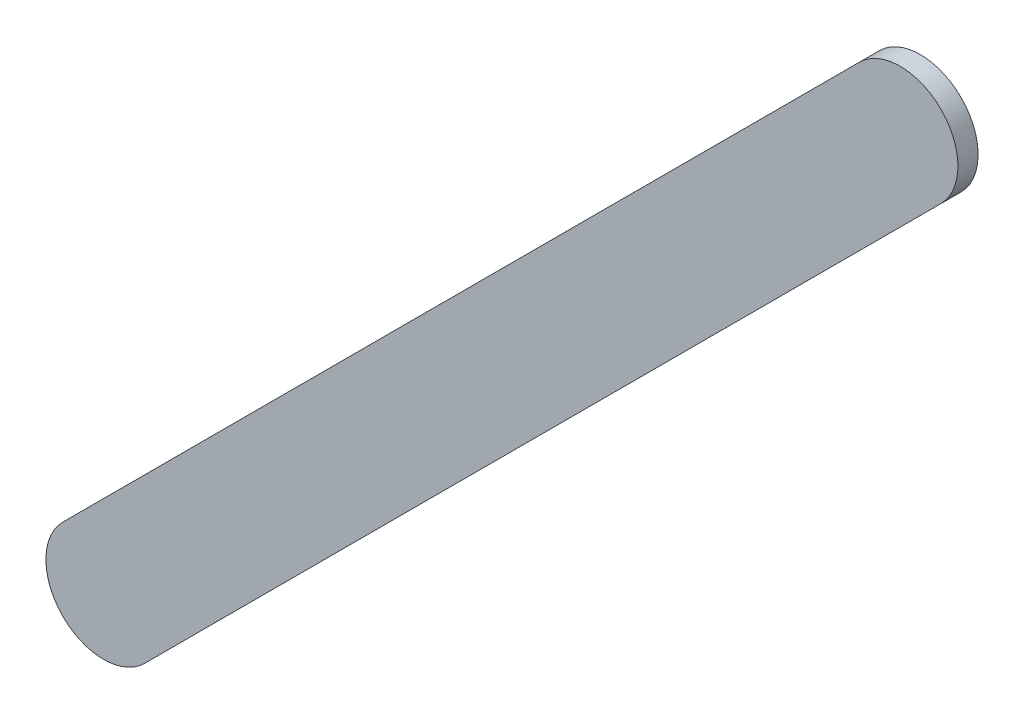
ISO-10303-21;
HEADER;
FILE_DESCRIPTION(('STEP AP214'),'2;1');
FILE_NAME('part.step','',(''),(''),'','','');
FILE_SCHEMA(('AUTOMOTIVE_DESIGN { 1 0 10303 214 1 1 1 1 }'));
ENDSEC;
DATA;
#1=APPLICATION_CONTEXT('core data for automotive mechanical design processes');
#2=APPLICATION_PROTOCOL_DEFINITION('international standard','automotive_design',2000,#1);
#3=PRODUCT_CONTEXT('',#1,'mechanical');
#4=PRODUCT('Part','Part','',(#3));
#5=PRODUCT_RELATED_PRODUCT_CATEGORY('part','',(#4));
#6=PRODUCT_DEFINITION_FORMATION('','',#4);
#7=PRODUCT_DEFINITION_CONTEXT('part definition',#1,'design');
#8=PRODUCT_DEFINITION('design','',#6,#7);
#9=PRODUCT_DEFINITION_SHAPE('','',#8);
#10=(LENGTH_UNIT() NAMED_UNIT(*) SI_UNIT(.MILLI.,.METRE.));
#11=(NAMED_UNIT(*) PLANE_ANGLE_UNIT() SI_UNIT($,.RADIAN.));
#12=(NAMED_UNIT(*) SI_UNIT($,.STERADIAN.) SOLID_ANGLE_UNIT());
#13=UNCERTAINTY_MEASURE_WITH_UNIT(LENGTH_MEASURE(1.E-05),#10,'distance_accuracy_value','');
#14=(GEOMETRIC_REPRESENTATION_CONTEXT(3) GLOBAL_UNCERTAINTY_ASSIGNED_CONTEXT((#13)) GLOBAL_UNIT_ASSIGNED_CONTEXT((#10,
#11,#12)) REPRESENTATION_CONTEXT('',''));
#15=CARTESIAN_POINT('',(0.,0.,0.));
#16=DIRECTION('',(0.,0.,1.));
#17=DIRECTION('',(1.,0.,0.));
#18=AXIS2_PLACEMENT_3D('',#15,#16,#17);
#19=CARTESIAN_POINT('',(108.77071,-104.47071,1.635));
#20=DIRECTION('',(0.,0.,1.));
#21=DIRECTION('',(1.,0.,0.));
#22=AXIS2_PLACEMENT_3D('',#19,#20,#21);
#23=PLANE('',#22);
#24=DIRECTION('',(0.707106781186548,0.707106781186548,0.));
#25=VECTOR('',#24,1.);
#26=CARTESIAN_POINT('',(108.77071,-104.47071,1.635));
#27=LINE('',#26,#25);
#28=CARTESIAN_POINT('',(108.77071,-104.47071,1.635));
#29=VERTEX_POINT('',#28);
#30=CARTESIAN_POINT('',(110.15071,-103.09071,1.635));
#31=VERTEX_POINT('',#30);
#32=EDGE_CURVE('E81',#29,#31,#27,.T.);
#33=ORIENTED_EDGE('',*,*,#32,.T.);
#34=CARTESIAN_POINT('',(110.0799995,-103.0199995,1.635));
#35=DIRECTION('',(0.,0.,1.));
#36=DIRECTION('',(0.707106781186548,-0.707106781186548,0.));
#37=AXIS2_PLACEMENT_3D('',#34,#35,#36);
#38=CIRCLE('',#37,0.09999974810219);
#39=CARTESIAN_POINT('',(110.009289,-102.949289,1.635));
#40=VERTEX_POINT('',#39);
#41=EDGE_CURVE('E101',#31,#40,#38,.T.);
#42=ORIENTED_EDGE('',*,*,#41,.T.);
#43=DIRECTION('',(-0.707106781186548,-0.707106781186548,0.));
#44=VECTOR('',#43,1.);
#45=CARTESIAN_POINT('',(110.009289,-102.949289,1.635));
#46=LINE('',#45,#44);
#47=CARTESIAN_POINT('',(108.629289,-104.329289,1.635));
#48=VERTEX_POINT('',#47);
#49=EDGE_CURVE('E74',#40,#48,#46,.T.);
#50=ORIENTED_EDGE('',*,*,#49,.T.);
#51=CARTESIAN_POINT('',(108.6999995,-104.3999995,1.635));
#52=DIRECTION('',(0.,0.,1.));
#53=DIRECTION('',(-0.707106781186048,0.707106781187048,0.));
#54=AXIS2_PLACEMENT_3D('',#51,#52,#53);
#55=CIRCLE('',#54,0.09999974810218);
#56=EDGE_CURVE('E11',#48,#29,#55,.T.);
#57=ORIENTED_EDGE('',*,*,#56,.T.);
#58=EDGE_LOOP('',(#33,#42,#50,#57));
#59=FACE_BOUND('',#58,.T.);
#60=ADVANCED_FACE('F17',(#59),#23,.T.);
#61=CARTESIAN_POINT('',(108.77071,-104.47071,1.6));
#62=DIRECTION('',(0.,0.,1.));
#63=DIRECTION('',(1.,0.,0.));
#64=AXIS2_PLACEMENT_3D('',#61,#62,#63);
#65=PLANE('',#64);
#66=CARTESIAN_POINT('',(108.6999995,-104.3999995,1.6));
#67=DIRECTION('',(0.,0.,1.));
#68=DIRECTION('',(-0.707106781186048,0.707106781187048,0.));
#69=AXIS2_PLACEMENT_3D('',#66,#67,#68);
#70=CIRCLE('',#69,0.09999974810218);
#71=CARTESIAN_POINT('',(108.629289,-104.329289,1.6));
#72=VERTEX_POINT('',#71);
#73=CARTESIAN_POINT('',(108.77071,-104.47071,1.6));
#74=VERTEX_POINT('',#73);
#75=EDGE_CURVE('E25',#72,#74,#70,.T.);
#76=ORIENTED_EDGE('',*,*,#75,.F.);
#77=DIRECTION('',(-0.707106781186548,-0.707106781186548,0.));
#78=VECTOR('',#77,1.);
#79=CARTESIAN_POINT('',(110.009289,-102.949289,1.6));
#80=LINE('',#79,#78);
#81=CARTESIAN_POINT('',(110.009289,-102.949289,1.6));
#82=VERTEX_POINT('',#81);
#83=EDGE_CURVE('E109',#82,#72,#80,.T.);
#84=ORIENTED_EDGE('',*,*,#83,.F.);
#85=CARTESIAN_POINT('',(110.0799995,-103.0199995,1.6));
#86=DIRECTION('',(0.,0.,1.));
#87=DIRECTION('',(0.707106781186548,-0.707106781186548,0.));
#88=AXIS2_PLACEMENT_3D('',#85,#86,#87);
#89=CIRCLE('',#88,0.09999974810219);
#90=CARTESIAN_POINT('',(110.15071,-103.09071,1.6));
#91=VERTEX_POINT('',#90);
#92=EDGE_CURVE('E83',#91,#82,#89,.T.);
#93=ORIENTED_EDGE('',*,*,#92,.F.);
#94=DIRECTION('',(0.707106781186548,0.707106781186548,0.));
#95=VECTOR('',#94,1.);
#96=CARTESIAN_POINT('',(108.77071,-104.47071,1.6));
#97=LINE('',#96,#95);
#98=EDGE_CURVE('E79',#74,#91,#97,.T.);
#99=ORIENTED_EDGE('',*,*,#98,.F.);
#100=EDGE_LOOP('',(#76,#84,#93,#99));
#101=FACE_BOUND('',#100,.T.);
#102=ADVANCED_FACE('F85',(#101),#65,.F.);
#103=CARTESIAN_POINT('',(108.6999995,-104.3999995,1.6));
#104=DIRECTION('',(0.,0.,-1.));
#105=DIRECTION('',(-0.707106781186048,0.707106781187048,0.));
#106=AXIS2_PLACEMENT_3D('',#103,#104,#105);
#107=CYLINDRICAL_SURFACE('',#106,0.09999974810218);
#108=ORIENTED_EDGE('',*,*,#75,.T.);
#109=DIRECTION('',(0.,0.,1.));
#110=VECTOR('',#109,1.);
#111=CARTESIAN_POINT('',(108.77071,-104.47071,1.6));
#112=LINE('',#111,#110);
#113=EDGE_CURVE('E68',#74,#29,#112,.T.);
#114=ORIENTED_EDGE('',*,*,#113,.T.);
#115=ORIENTED_EDGE('',*,*,#56,.F.);
#116=DIRECTION('',(0.,0.,1.));
#117=VECTOR('',#116,1.);
#118=CARTESIAN_POINT('',(108.629289,-104.329289,1.6));
#119=LINE('',#118,#117);
#120=EDGE_CURVE('E71',#72,#48,#119,.T.);
#121=ORIENTED_EDGE('',*,*,#120,.F.);
#122=EDGE_LOOP('',(#108,#114,#115,#121));
#123=FACE_BOUND('',#122,.T.);
#124=ADVANCED_FACE('F67',(#123),#107,.T.);
#125=CARTESIAN_POINT('',(110.009289,-102.949289,1.6));
#126=DIRECTION('',(0.707106781186548,-0.707106781186548,0.));
#127=DIRECTION('',(0.,0.,-1.));
#128=AXIS2_PLACEMENT_3D('',#125,#126,#127);
#129=PLANE('',#128);
#130=ORIENTED_EDGE('',*,*,#83,.T.);
#131=ORIENTED_EDGE('',*,*,#120,.T.);
#132=ORIENTED_EDGE('',*,*,#49,.F.);
#133=DIRECTION('',(0.,0.,1.));
#134=VECTOR('',#133,1.);
#135=CARTESIAN_POINT('',(110.009289,-102.949289,1.6));
#136=LINE('',#135,#134);
#137=EDGE_CURVE('E97',#82,#40,#136,.T.);
#138=ORIENTED_EDGE('',*,*,#137,.F.);
#139=EDGE_LOOP('',(#130,#131,#132,#138));
#140=FACE_BOUND('',#139,.T.);
#141=ADVANCED_FACE('F120',(#140),#129,.F.);
#142=CARTESIAN_POINT('',(110.0799995,-103.0199995,1.6));
#143=DIRECTION('',(0.,0.,-1.));
#144=DIRECTION('',(0.707106781186548,-0.707106781186548,0.));
#145=AXIS2_PLACEMENT_3D('',#142,#143,#144);
#146=CYLINDRICAL_SURFACE('',#145,0.09999974810219);
#147=ORIENTED_EDGE('',*,*,#92,.T.);
#148=ORIENTED_EDGE('',*,*,#137,.T.);
#149=ORIENTED_EDGE('',*,*,#41,.F.);
#150=DIRECTION('',(0.,0.,1.));
#151=VECTOR('',#150,1.);
#152=CARTESIAN_POINT('',(110.15071,-103.09071,1.6));
#153=LINE('',#152,#151);
#154=EDGE_CURVE('E89',#91,#31,#153,.T.);
#155=ORIENTED_EDGE('',*,*,#154,.F.);
#156=EDGE_LOOP('',(#147,#148,#149,#155));
#157=FACE_BOUND('',#156,.T.);
#158=ADVANCED_FACE('F122',(#157),#146,.T.);
#159=CARTESIAN_POINT('',(108.77071,-104.47071,1.6));
#160=DIRECTION('',(-0.707106781186548,0.707106781186548,0.));
#161=DIRECTION('',(0.,0.,1.));
#162=AXIS2_PLACEMENT_3D('',#159,#160,#161);
#163=PLANE('',#162);
#164=ORIENTED_EDGE('',*,*,#98,.T.);
#165=ORIENTED_EDGE('',*,*,#154,.T.);
#166=ORIENTED_EDGE('',*,*,#32,.F.);
#167=ORIENTED_EDGE('',*,*,#113,.F.);
#168=EDGE_LOOP('',(#164,#165,#166,#167));
#169=FACE_BOUND('',#168,.T.);
#170=ADVANCED_FACE('F77',(#169),#163,.F.);
#171=CLOSED_SHELL('',(#60,#102,#124,#141,#158,#170));
#172=MANIFOLD_SOLID_BREP('B1',#171);
#173=ADVANCED_BREP_SHAPE_REPRESENTATION('',(#18,#172),#14);
#174=SHAPE_DEFINITION_REPRESENTATION(#9,#173);
ENDSEC;
END-ISO-10303-21;
